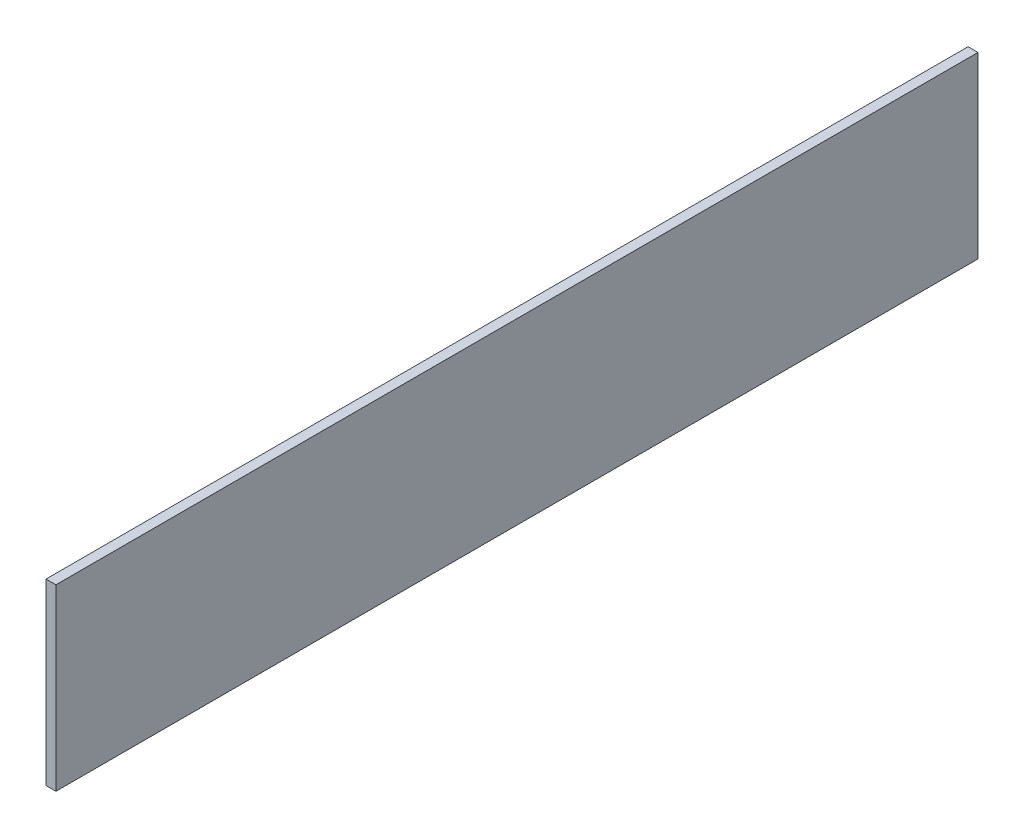
ISO-10303-21;
HEADER;
FILE_DESCRIPTION(('STEP AP214'),'2;1');
FILE_NAME('part.step','',(''),(''),'','','');
FILE_SCHEMA(('AUTOMOTIVE_DESIGN { 1 0 10303 214 1 1 1 1 }'));
ENDSEC;
DATA;
#1=APPLICATION_CONTEXT('core data for automotive mechanical design processes');
#2=APPLICATION_PROTOCOL_DEFINITION('international standard','automotive_design',2000,#1);
#3=PRODUCT_CONTEXT('',#1,'mechanical');
#4=PRODUCT('Part','Part','',(#3));
#5=PRODUCT_RELATED_PRODUCT_CATEGORY('part','',(#4));
#6=PRODUCT_DEFINITION_FORMATION('','',#4);
#7=PRODUCT_DEFINITION_CONTEXT('part definition',#1,'design');
#8=PRODUCT_DEFINITION('design','',#6,#7);
#9=PRODUCT_DEFINITION_SHAPE('','',#8);
#10=(LENGTH_UNIT() NAMED_UNIT(*) SI_UNIT(.MILLI.,.METRE.));
#11=(NAMED_UNIT(*) PLANE_ANGLE_UNIT() SI_UNIT($,.RADIAN.));
#12=(NAMED_UNIT(*) SI_UNIT($,.STERADIAN.) SOLID_ANGLE_UNIT());
#13=UNCERTAINTY_MEASURE_WITH_UNIT(LENGTH_MEASURE(1.E-05),#10,'distance_accuracy_value','');
#14=(GEOMETRIC_REPRESENTATION_CONTEXT(3) GLOBAL_UNCERTAINTY_ASSIGNED_CONTEXT((#13)) GLOBAL_UNIT_ASSIGNED_CONTEXT((#10,
#11,#12)) REPRESENTATION_CONTEXT('',''));
#15=CARTESIAN_POINT('',(0.,0.,0.));
#16=DIRECTION('',(0.,0.,1.));
#17=DIRECTION('',(1.,0.,0.));
#18=AXIS2_PLACEMENT_3D('',#15,#16,#17);
#19=CARTESIAN_POINT('',(0.,0.,294.64));
#20=DIRECTION('',(1.,0.,0.));
#21=DIRECTION('',(0.,0.,-1.));
#22=AXIS2_PLACEMENT_3D('',#19,#20,#21);
#23=PLANE('',#22);
#24=DIRECTION('',(0.,-1.,0.));
#25=VECTOR('',#24,1.);
#26=CARTESIAN_POINT('',(0.,0.,0.));
#27=LINE('',#26,#25);
#28=CARTESIAN_POINT('',(0.,57.15,0.));
#29=VERTEX_POINT('',#28);
#30=CARTESIAN_POINT('',(0.,0.,0.));
#31=VERTEX_POINT('',#30);
#32=EDGE_CURVE('E107',#29,#31,#27,.T.);
#33=ORIENTED_EDGE('',*,*,#32,.T.);
#34=DIRECTION('',(0.,0.,-1.));
#35=VECTOR('',#34,1.);
#36=CARTESIAN_POINT('',(0.,0.,294.64));
#37=LINE('',#36,#35);
#38=CARTESIAN_POINT('',(0.,0.,294.64));
#39=VERTEX_POINT('',#38);
#40=EDGE_CURVE('E11',#39,#31,#37,.T.);
#41=ORIENTED_EDGE('',*,*,#40,.F.);
#42=DIRECTION('',(0.,-1.,0.));
#43=VECTOR('',#42,1.);
#44=CARTESIAN_POINT('',(0.,0.,294.64));
#45=LINE('',#44,#43);
#46=CARTESIAN_POINT('',(0.,57.15,294.64));
#47=VERTEX_POINT('',#46);
#48=EDGE_CURVE('E91',#47,#39,#45,.T.);
#49=ORIENTED_EDGE('',*,*,#48,.F.);
#50=DIRECTION('',(0.,0.,-1.));
#51=VECTOR('',#50,1.);
#52=CARTESIAN_POINT('',(0.,57.15,294.64));
#53=LINE('',#52,#51);
#54=EDGE_CURVE('E103',#47,#29,#53,.T.);
#55=ORIENTED_EDGE('',*,*,#54,.T.);
#56=EDGE_LOOP('',(#33,#41,#49,#55));
#57=FACE_BOUND('',#56,.T.);
#58=ADVANCED_FACE('F39',(#57),#23,.F.);
#59=CARTESIAN_POINT('',(0.,0.,294.64));
#60=DIRECTION('',(0.,1.,0.));
#61=DIRECTION('',(0.,0.,1.));
#62=AXIS2_PLACEMENT_3D('',#59,#60,#61);
#63=PLANE('',#62);
#64=DIRECTION('',(1.,0.,0.));
#65=VECTOR('',#64,1.);
#66=CARTESIAN_POINT('',(0.,0.,0.));
#67=LINE('',#66,#65);
#68=CARTESIAN_POINT('',(3.175,0.,0.));
#69=VERTEX_POINT('',#68);
#70=EDGE_CURVE('E96',#31,#69,#67,.T.);
#71=ORIENTED_EDGE('',*,*,#70,.T.);
#72=DIRECTION('',(0.,0.,-1.));
#73=VECTOR('',#72,1.);
#74=CARTESIAN_POINT('',(3.175,0.,294.64));
#75=LINE('',#74,#73);
#76=CARTESIAN_POINT('',(3.175,0.,294.64));
#77=VERTEX_POINT('',#76);
#78=EDGE_CURVE('E48',#77,#69,#75,.T.);
#79=ORIENTED_EDGE('',*,*,#78,.F.);
#80=DIRECTION('',(1.,0.,0.));
#81=VECTOR('',#80,1.);
#82=CARTESIAN_POINT('',(0.,0.,294.64));
#83=LINE('',#82,#81);
#84=EDGE_CURVE('E86',#39,#77,#83,.T.);
#85=ORIENTED_EDGE('',*,*,#84,.F.);
#86=ORIENTED_EDGE('',*,*,#40,.T.);
#87=EDGE_LOOP('',(#71,#79,#85,#86));
#88=FACE_BOUND('',#87,.T.);
#89=ADVANCED_FACE('F95',(#88),#63,.F.);
#90=CARTESIAN_POINT('',(3.175,0.,294.64));
#91=DIRECTION('',(-1.,0.,0.));
#92=DIRECTION('',(0.,0.,1.));
#93=AXIS2_PLACEMENT_3D('',#90,#91,#92);
#94=PLANE('',#93);
#95=DIRECTION('',(0.,1.,0.));
#96=VECTOR('',#95,1.);
#97=CARTESIAN_POINT('',(3.175,0.,0.));
#98=LINE('',#97,#96);
#99=CARTESIAN_POINT('',(3.175,57.15,0.));
#100=VERTEX_POINT('',#99);
#101=EDGE_CURVE('E73',#69,#100,#98,.T.);
#102=ORIENTED_EDGE('',*,*,#101,.T.);
#103=DIRECTION('',(0.,0.,-1.));
#104=VECTOR('',#103,1.);
#105=CARTESIAN_POINT('',(3.175,57.15,294.64));
#106=LINE('',#105,#104);
#107=CARTESIAN_POINT('',(3.175,57.15,294.64));
#108=VERTEX_POINT('',#107);
#109=EDGE_CURVE('E98',#108,#100,#106,.T.);
#110=ORIENTED_EDGE('',*,*,#109,.F.);
#111=DIRECTION('',(0.,1.,0.));
#112=VECTOR('',#111,1.);
#113=CARTESIAN_POINT('',(3.175,0.,294.64));
#114=LINE('',#113,#112);
#115=EDGE_CURVE('E89',#77,#108,#114,.T.);
#116=ORIENTED_EDGE('',*,*,#115,.F.);
#117=ORIENTED_EDGE('',*,*,#78,.T.);
#118=EDGE_LOOP('',(#102,#110,#116,#117));
#119=FACE_BOUND('',#118,.T.);
#120=ADVANCED_FACE('F99',(#119),#94,.F.);
#121=CARTESIAN_POINT('',(0.,57.15,294.64));
#122=DIRECTION('',(0.,-1.,0.));
#123=DIRECTION('',(0.,0.,-1.));
#124=AXIS2_PLACEMENT_3D('',#121,#122,#123);
#125=PLANE('',#124);
#126=DIRECTION('',(-1.,0.,0.));
#127=VECTOR('',#126,1.);
#128=CARTESIAN_POINT('',(0.,57.15,0.));
#129=LINE('',#128,#127);
#130=EDGE_CURVE('E79',#100,#29,#129,.T.);
#131=ORIENTED_EDGE('',*,*,#130,.T.);
#132=ORIENTED_EDGE('',*,*,#54,.F.);
#133=DIRECTION('',(-1.,0.,0.));
#134=VECTOR('',#133,1.);
#135=CARTESIAN_POINT('',(0.,57.15,294.64));
#136=LINE('',#135,#134);
#137=EDGE_CURVE('E56',#108,#47,#136,.T.);
#138=ORIENTED_EDGE('',*,*,#137,.F.);
#139=ORIENTED_EDGE('',*,*,#109,.T.);
#140=EDGE_LOOP('',(#131,#132,#138,#139));
#141=FACE_BOUND('',#140,.T.);
#142=ADVANCED_FACE('F120',(#141),#125,.F.);
#143=CARTESIAN_POINT('',(0.,0.,294.64));
#144=DIRECTION('',(0.,0.,-1.));
#145=DIRECTION('',(-1.,0.,0.));
#146=AXIS2_PLACEMENT_3D('',#143,#144,#145);
#147=PLANE('',#146);
#148=ORIENTED_EDGE('',*,*,#48,.T.);
#149=ORIENTED_EDGE('',*,*,#84,.T.);
#150=ORIENTED_EDGE('',*,*,#115,.T.);
#151=ORIENTED_EDGE('',*,*,#137,.T.);
#152=EDGE_LOOP('',(#148,#149,#150,#151));
#153=FACE_BOUND('',#152,.T.);
#154=ADVANCED_FACE('F87',(#153),#147,.F.);
#155=CARTESIAN_POINT('',(0.,0.,0.));
#156=DIRECTION('',(0.,0.,-1.));
#157=DIRECTION('',(-1.,0.,0.));
#158=AXIS2_PLACEMENT_3D('',#155,#156,#157);
#159=PLANE('',#158);
#160=ORIENTED_EDGE('',*,*,#32,.F.);
#161=ORIENTED_EDGE('',*,*,#130,.F.);
#162=ORIENTED_EDGE('',*,*,#101,.F.);
#163=ORIENTED_EDGE('',*,*,#70,.F.);
#164=EDGE_LOOP('',(#160,#161,#162,#163));
#165=FACE_BOUND('',#164,.T.);
#166=ADVANCED_FACE('F123',(#165),#159,.T.);
#167=CLOSED_SHELL('',(#58,#89,#120,#142,#154,#166));
#168=MANIFOLD_SOLID_BREP('B2',#167);
#169=ADVANCED_BREP_SHAPE_REPRESENTATION('',(#18,#168),#14);
#170=SHAPE_DEFINITION_REPRESENTATION(#9,#169);
ENDSEC;
END-ISO-10303-21;
